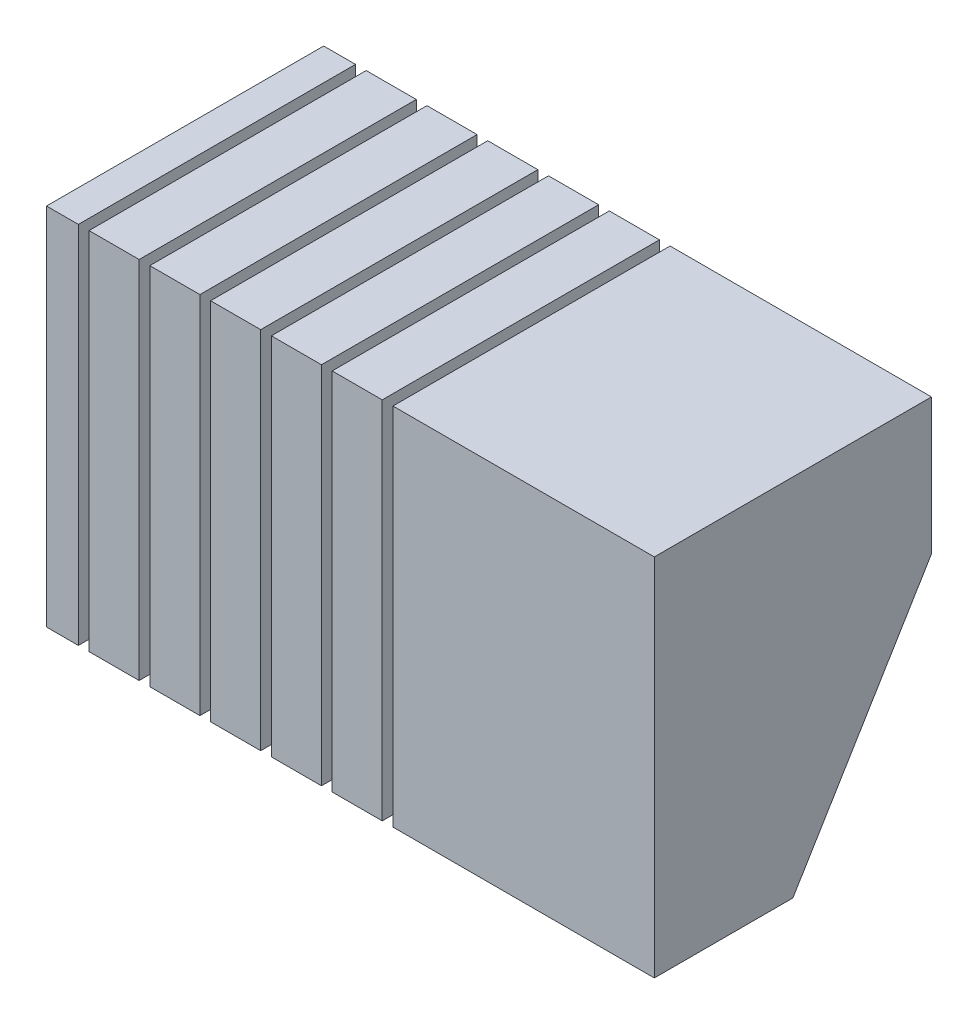
ISO-10303-21;
HEADER;
FILE_DESCRIPTION(('STEP AP214'),'2;1');
FILE_NAME('part.step','',(''),(''),'','','');
FILE_SCHEMA(('AUTOMOTIVE_DESIGN { 1 0 10303 214 1 1 1 1 }'));
ENDSEC;
DATA;
#1=APPLICATION_CONTEXT('core data for automotive mechanical design processes');
#2=APPLICATION_PROTOCOL_DEFINITION('international standard','automotive_design',2000,#1);
#3=PRODUCT_CONTEXT('',#1,'mechanical');
#4=PRODUCT('Part','Part','',(#3));
#5=PRODUCT_RELATED_PRODUCT_CATEGORY('part','',(#4));
#6=PRODUCT_DEFINITION_FORMATION('','',#4);
#7=PRODUCT_DEFINITION_CONTEXT('part definition',#1,'design');
#8=PRODUCT_DEFINITION('design','',#6,#7);
#9=PRODUCT_DEFINITION_SHAPE('','',#8);
#10=(LENGTH_UNIT() NAMED_UNIT(*) SI_UNIT(.MILLI.,.METRE.));
#11=(NAMED_UNIT(*) PLANE_ANGLE_UNIT() SI_UNIT($,.RADIAN.));
#12=(NAMED_UNIT(*) SI_UNIT($,.STERADIAN.) SOLID_ANGLE_UNIT());
#13=UNCERTAINTY_MEASURE_WITH_UNIT(LENGTH_MEASURE(1.E-05),#10,'distance_accuracy_value','');
#14=(GEOMETRIC_REPRESENTATION_CONTEXT(3) GLOBAL_UNCERTAINTY_ASSIGNED_CONTEXT((#13)) GLOBAL_UNIT_ASSIGNED_CONTEXT((#10,
#11,#12)) REPRESENTATION_CONTEXT('',''));
#15=CARTESIAN_POINT('',(0.,0.,0.));
#16=DIRECTION('',(0.,0.,1.));
#17=DIRECTION('',(1.,0.,0.));
#18=AXIS2_PLACEMENT_3D('',#15,#16,#17);
#19=CARTESIAN_POINT('',(125.,-75.,114.));
#20=DIRECTION('',(-1.,0.,0.));
#21=DIRECTION('',(0.,0.,1.));
#22=AXIS2_PLACEMENT_3D('',#19,#20,#21);
#23=PLANE('',#22);
#24=DIRECTION('',(0.,-0.855226725322334,0.518254038377355));
#25=VECTOR('',#24,1.);
#26=CARTESIAN_POINT('',(125.,-100.263808135213,72.3094731527829));
#27=LINE('',#26,#25);
#28=CARTESIAN_POINT('',(125.,19.0618301711685,0.));
#29=VERTEX_POINT('',#28);
#30=CARTESIAN_POINT('',(125.,-75.,56.9999999999999));
#31=VERTEX_POINT('',#30);
#32=EDGE_CURVE('E123',#29,#31,#27,.T.);
#33=ORIENTED_EDGE('',*,*,#32,.F.);
#34=DIRECTION('',(0.,1.,0.));
#35=VECTOR('',#34,1.);
#36=CARTESIAN_POINT('',(125.,-75.,0.));
#37=LINE('',#36,#35);
#38=CARTESIAN_POINT('',(125.,75.,0.));
#39=VERTEX_POINT('',#38);
#40=EDGE_CURVE('E115',#29,#39,#37,.T.);
#41=ORIENTED_EDGE('',*,*,#40,.T.);
#42=DIRECTION('',(0.,0.,-1.));
#43=VECTOR('',#42,1.);
#44=CARTESIAN_POINT('',(125.,75.,114.));
#45=LINE('',#44,#43);
#46=CARTESIAN_POINT('',(125.,75.,114.));
#47=VERTEX_POINT('',#46);
#48=EDGE_CURVE('E127',#47,#39,#45,.T.);
#49=ORIENTED_EDGE('',*,*,#48,.F.);
#50=DIRECTION('',(0.,1.,0.));
#51=VECTOR('',#50,1.);
#52=CARTESIAN_POINT('',(125.,-75.,114.));
#53=LINE('',#52,#51);
#54=CARTESIAN_POINT('',(125.,-75.,114.));
#55=VERTEX_POINT('',#54);
#56=EDGE_CURVE('E119',#55,#47,#53,.T.);
#57=ORIENTED_EDGE('',*,*,#56,.F.);
#58=DIRECTION('',(0.,0.,-1.));
#59=VECTOR('',#58,1.);
#60=CARTESIAN_POINT('',(125.,-75.,114.));
#61=LINE('',#60,#59);
#62=EDGE_CURVE('E110',#55,#31,#61,.T.);
#63=ORIENTED_EDGE('',*,*,#62,.T.);
#64=EDGE_LOOP('',(#33,#41,#49,#57,#63));
#65=FACE_BOUND('',#64,.T.);
#66=ADVANCED_FACE('F49',(#65),#23,.F.);
#67=CARTESIAN_POINT('',(-125.,-75.,114.));
#68=DIRECTION('',(0.,1.,0.));
#69=DIRECTION('',(0.,0.,1.));
#70=AXIS2_PLACEMENT_3D('',#67,#68,#69);
#71=PLANE('',#70);
#72=DIRECTION('',(1.,0.,0.));
#73=VECTOR('',#72,1.);
#74=CARTESIAN_POINT('',(-125.,-75.,114.));
#75=LINE('',#74,#73);
#76=CARTESIAN_POINT('',(17.4871129549344,-75.,114.));
#77=VERTEX_POINT('',#76);
#78=EDGE_CURVE('E105',#77,#55,#75,.T.);
#79=ORIENTED_EDGE('',*,*,#78,.F.);
#80=DIRECTION('',(0.,0.,1.));
#81=VECTOR('',#80,1.);
#82=CARTESIAN_POINT('',(17.4871129549344,-75.,-16.0571550711005));
#83=LINE('',#82,#81);
#84=CARTESIAN_POINT('',(17.4871129549344,-75.,0.));
#85=VERTEX_POINT('',#84);
#86=EDGE_CURVE('E12',#85,#77,#83,.T.);
#87=ORIENTED_EDGE('',*,*,#86,.F.);
#88=DIRECTION('',(1.,0.,0.));
#89=VECTOR('',#88,1.);
#90=CARTESIAN_POINT('',(-125.,-75.,0.));
#91=LINE('',#90,#89);
#92=CARTESIAN_POINT('',(42.292495755744,-75.,0.));
#93=VERTEX_POINT('',#92);
#94=EDGE_CURVE('E102',#85,#93,#91,.T.);
#95=ORIENTED_EDGE('',*,*,#94,.T.);
#96=DIRECTION('',(-0.823397266330031,0.,-0.567465366168044));
#97=VECTOR('',#96,1.);
#98=CARTESIAN_POINT('',(-17.862546969277,-75.,-41.4573921273211));
#99=LINE('',#98,#97);
#100=EDGE_CURVE('E97',#31,#93,#99,.T.);
#101=ORIENTED_EDGE('',*,*,#100,.F.);
#102=ORIENTED_EDGE('',*,*,#62,.F.);
#103=EDGE_LOOP('',(#79,#87,#95,#101,#102));
#104=FACE_BOUND('',#103,.T.);
#105=ADVANCED_FACE('F51',(#104),#71,.F.);
#106=CARTESIAN_POINT('',(0.,0.,0.));
#107=DIRECTION('',(0.,0.,-1.));
#108=DIRECTION('',(-1.,0.,0.));
#109=AXIS2_PLACEMENT_3D('',#106,#107,#108);
#110=PLANE('',#109);
#111=DIRECTION('',(0.,-1.,0.));
#112=VECTOR('',#111,1.);
#113=CARTESIAN_POINT('',(17.4871129549344,0.,0.));
#114=LINE('',#113,#112);
#115=CARTESIAN_POINT('',(17.4871129549344,75.,0.));
#116=VERTEX_POINT('',#115);
#117=EDGE_CURVE('E59',#116,#85,#114,.T.);
#118=ORIENTED_EDGE('',*,*,#117,.F.);
#119=DIRECTION('',(-1.,0.,0.));
#120=VECTOR('',#119,1.);
#121=CARTESIAN_POINT('',(-125.,75.,0.));
#122=LINE('',#121,#120);
#123=EDGE_CURVE('E112',#39,#116,#122,.T.);
#124=ORIENTED_EDGE('',*,*,#123,.F.);
#125=ORIENTED_EDGE('',*,*,#40,.F.);
#126=DIRECTION('',(-0.66032679808164,-0.750978375011724,0.));
#127=VECTOR('',#126,1.);
#128=CARTESIAN_POINT('',(61.0434721622796,-53.6748351989157,0.));
#129=LINE('',#128,#127);
#130=EDGE_CURVE('E109',#29,#93,#129,.T.);
#131=ORIENTED_EDGE('',*,*,#130,.T.);
#132=ORIENTED_EDGE('',*,*,#94,.F.);
#133=EDGE_LOOP('',(#118,#124,#125,#131,#132));
#134=FACE_BOUND('',#133,.T.);
#135=ADVANCED_FACE('F107',(#134),#110,.T.);
#136=CARTESIAN_POINT('',(-125.,75.,114.));
#137=DIRECTION('',(0.,-1.,0.));
#138=DIRECTION('',(0.,0.,-1.));
#139=AXIS2_PLACEMENT_3D('',#136,#137,#138);
#140=PLANE('',#139);
#141=ORIENTED_EDGE('',*,*,#123,.T.);
#142=DIRECTION('',(0.,0.,1.));
#143=VECTOR('',#142,1.);
#144=CARTESIAN_POINT('',(17.4871129549344,75.,-16.0571550711005));
#145=LINE('',#144,#143);
#146=CARTESIAN_POINT('',(17.4871129549344,75.,114.));
#147=VERTEX_POINT('',#146);
#148=EDGE_CURVE('E67',#116,#147,#145,.T.);
#149=ORIENTED_EDGE('',*,*,#148,.T.);
#150=DIRECTION('',(-1.,0.,0.));
#151=VECTOR('',#150,1.);
#152=CARTESIAN_POINT('',(-125.,75.,114.));
#153=LINE('',#152,#151);
#154=EDGE_CURVE('E53',#47,#147,#153,.T.);
#155=ORIENTED_EDGE('',*,*,#154,.F.);
#156=ORIENTED_EDGE('',*,*,#48,.T.);
#157=EDGE_LOOP('',(#141,#149,#155,#156));
#158=FACE_BOUND('',#157,.T.);
#159=ADVANCED_FACE('F135',(#158),#140,.F.);
#160=CARTESIAN_POINT('',(0.,0.,114.));
#161=DIRECTION('',(0.,0.,-1.));
#162=DIRECTION('',(-1.,0.,0.));
#163=AXIS2_PLACEMENT_3D('',#160,#161,#162);
#164=PLANE('',#163);
#165=ORIENTED_EDGE('',*,*,#154,.T.);
#166=DIRECTION('',(0.,-1.,0.));
#167=VECTOR('',#166,1.);
#168=CARTESIAN_POINT('',(17.4871129549344,0.,114.));
#169=LINE('',#168,#167);
#170=EDGE_CURVE('E120',#147,#77,#169,.T.);
#171=ORIENTED_EDGE('',*,*,#170,.T.);
#172=ORIENTED_EDGE('',*,*,#78,.T.);
#173=ORIENTED_EDGE('',*,*,#56,.T.);
#174=EDGE_LOOP('',(#165,#171,#172,#173));
#175=FACE_BOUND('',#174,.T.);
#176=ADVANCED_FACE('F136',(#175),#164,.F.);
#177=CARTESIAN_POINT('',(27.9069349234818,-24.5382524923008,-40.4932094496149));
#178=DIRECTION('',(0.507766315458884,-0.446473182740372,-0.736773415629929));
#179=DIRECTION('',(-0.823397266330031,0.,-0.567465366168044));
#180=AXIS2_PLACEMENT_3D('',#177,#178,#179);
#181=PLANE('',#180);
#182=ORIENTED_EDGE('',*,*,#32,.T.);
#183=ORIENTED_EDGE('',*,*,#100,.T.);
#184=ORIENTED_EDGE('',*,*,#130,.F.);
#185=EDGE_LOOP('',(#182,#183,#184));
#186=FACE_BOUND('',#185,.T.);
#187=ADVANCED_FACE('F141',(#186),#181,.T.);
#188=CARTESIAN_POINT('',(17.4871129549344,75.,-16.0571550711005));
#189=DIRECTION('',(1.,0.,0.));
#190=DIRECTION('',(0.,0.,-1.));
#191=AXIS2_PLACEMENT_3D('',#188,#189,#190);
#192=PLANE('',#191);
#193=ORIENTED_EDGE('',*,*,#117,.T.);
#194=ORIENTED_EDGE('',*,*,#86,.T.);
#195=ORIENTED_EDGE('',*,*,#170,.F.);
#196=ORIENTED_EDGE('',*,*,#148,.F.);
#197=EDGE_LOOP('',(#193,#194,#195,#196));
#198=FACE_BOUND('',#197,.T.);
#199=ADVANCED_FACE('F92',(#198),#192,.F.);
#200=CLOSED_SHELL('',(#66,#105,#135,#159,#176,#187,#199));
#201=MANIFOLD_SOLID_BREP('B2',#200);
#202=CARTESIAN_POINT('',(0.,0.,114.));
#203=DIRECTION('',(0.,0.,-1.));
#204=DIRECTION('',(-1.,0.,0.));
#205=AXIS2_PLACEMENT_3D('',#202,#203,#204);
#206=PLANE('',#205);
#207=DIRECTION('',(-1.,0.,0.));
#208=VECTOR('',#207,1.);
#209=CARTESIAN_POINT('',(-125.,75.,114.));
#210=LINE('',#209,#208);
#211=CARTESIAN_POINT('',(13.089023351992,75.,114.));
#212=VERTEX_POINT('',#211);
#213=CARTESIAN_POINT('',(-7.51288704506556,75.,114.));
#214=VERTEX_POINT('',#213);
#215=EDGE_CURVE('E212',#212,#214,#210,.T.);
#216=ORIENTED_EDGE('',*,*,#215,.T.);
#217=DIRECTION('',(0.,-1.,0.));
#218=VECTOR('',#217,1.);
#219=CARTESIAN_POINT('',(-7.51288704506556,0.,114.));
#220=LINE('',#219,#218);
#221=CARTESIAN_POINT('',(-7.51288704506556,-75.,114.));
#222=VERTEX_POINT('',#221);
#223=EDGE_CURVE('E254',#214,#222,#220,.T.);
#224=ORIENTED_EDGE('',*,*,#223,.T.);
#225=DIRECTION('',(1.,0.,0.));
#226=VECTOR('',#225,1.);
#227=CARTESIAN_POINT('',(-125.,-75.,114.));
#228=LINE('',#227,#226);
#229=CARTESIAN_POINT('',(13.089023351992,-75.,114.));
#230=VERTEX_POINT('',#229);
#231=EDGE_CURVE('E262',#222,#230,#228,.T.);
#232=ORIENTED_EDGE('',*,*,#231,.T.);
#233=DIRECTION('',(0.,1.,0.));
#234=VECTOR('',#233,1.);
#235=CARTESIAN_POINT('',(13.089023351992,0.,114.));
#236=LINE('',#235,#234);
#237=EDGE_CURVE('E247',#230,#212,#236,.T.);
#238=ORIENTED_EDGE('',*,*,#237,.T.);
#239=EDGE_LOOP('',(#216,#224,#232,#238));
#240=FACE_BOUND('',#239,.T.);
#241=ADVANCED_FACE('F208',(#240),#206,.F.);
#242=CARTESIAN_POINT('',(-125.,75.,114.));
#243=DIRECTION('',(0.,-1.,0.));
#244=DIRECTION('',(0.,0.,-1.));
#245=AXIS2_PLACEMENT_3D('',#242,#243,#244);
#246=PLANE('',#245);
#247=DIRECTION('',(-1.,0.,0.));
#248=VECTOR('',#247,1.);
#249=CARTESIAN_POINT('',(-125.,75.,0.));
#250=LINE('',#249,#248);
#251=CARTESIAN_POINT('',(13.089023351992,75.,0.));
#252=VERTEX_POINT('',#251);
#253=CARTESIAN_POINT('',(-7.51288704506556,75.,0.));
#254=VERTEX_POINT('',#253);
#255=EDGE_CURVE('E265',#252,#254,#250,.T.);
#256=ORIENTED_EDGE('',*,*,#255,.T.);
#257=DIRECTION('',(0.,0.,1.));
#258=VECTOR('',#257,1.);
#259=CARTESIAN_POINT('',(-7.51288704506556,75.,-16.0571550711005));
#260=LINE('',#259,#258);
#261=EDGE_CURVE('E227',#254,#214,#260,.T.);
#262=ORIENTED_EDGE('',*,*,#261,.T.);
#263=ORIENTED_EDGE('',*,*,#215,.F.);
#264=DIRECTION('',(0.,0.,-1.));
#265=VECTOR('',#264,1.);
#266=CARTESIAN_POINT('',(13.089023351992,75.,-16.0571550711005));
#267=LINE('',#266,#265);
#268=EDGE_CURVE('E249',#212,#252,#267,.T.);
#269=ORIENTED_EDGE('',*,*,#268,.T.);
#270=EDGE_LOOP('',(#256,#262,#263,#269));
#271=FACE_BOUND('',#270,.T.);
#272=ADVANCED_FACE('F281',(#271),#246,.F.);
#273=CARTESIAN_POINT('',(0.,0.,0.));
#274=DIRECTION('',(0.,0.,-1.));
#275=DIRECTION('',(-1.,0.,0.));
#276=AXIS2_PLACEMENT_3D('',#273,#274,#275);
#277=PLANE('',#276);
#278=DIRECTION('',(0.,-1.,0.));
#279=VECTOR('',#278,1.);
#280=CARTESIAN_POINT('',(-7.51288704506556,0.,0.));
#281=LINE('',#280,#279);
#282=CARTESIAN_POINT('',(-7.51288704506556,-75.,0.));
#283=VERTEX_POINT('',#282);
#284=EDGE_CURVE('E218',#254,#283,#281,.T.);
#285=ORIENTED_EDGE('',*,*,#284,.F.);
#286=ORIENTED_EDGE('',*,*,#255,.F.);
#287=DIRECTION('',(0.,1.,0.));
#288=VECTOR('',#287,1.);
#289=CARTESIAN_POINT('',(13.089023351992,0.,0.));
#290=LINE('',#289,#288);
#291=CARTESIAN_POINT('',(13.089023351992,-75.,0.));
#292=VERTEX_POINT('',#291);
#293=EDGE_CURVE('E272',#292,#252,#290,.T.);
#294=ORIENTED_EDGE('',*,*,#293,.F.);
#295=DIRECTION('',(1.,0.,0.));
#296=VECTOR('',#295,1.);
#297=CARTESIAN_POINT('',(-125.,-75.,0.));
#298=LINE('',#297,#296);
#299=EDGE_CURVE('E270',#283,#292,#298,.T.);
#300=ORIENTED_EDGE('',*,*,#299,.F.);
#301=EDGE_LOOP('',(#285,#286,#294,#300));
#302=FACE_BOUND('',#301,.T.);
#303=ADVANCED_FACE('F282',(#302),#277,.T.);
#304=CARTESIAN_POINT('',(-125.,-75.,114.));
#305=DIRECTION('',(0.,1.,0.));
#306=DIRECTION('',(0.,0.,1.));
#307=AXIS2_PLACEMENT_3D('',#304,#305,#306);
#308=PLANE('',#307);
#309=ORIENTED_EDGE('',*,*,#231,.F.);
#310=DIRECTION('',(0.,0.,1.));
#311=VECTOR('',#310,1.);
#312=CARTESIAN_POINT('',(-7.51288704506556,-75.,-16.0571550711005));
#313=LINE('',#312,#311);
#314=EDGE_CURVE('E47',#283,#222,#313,.T.);
#315=ORIENTED_EDGE('',*,*,#314,.F.);
#316=ORIENTED_EDGE('',*,*,#299,.T.);
#317=DIRECTION('',(0.,0.,-1.));
#318=VECTOR('',#317,1.);
#319=CARTESIAN_POINT('',(13.089023351992,-75.,-16.0571550711005));
#320=LINE('',#319,#318);
#321=EDGE_CURVE('E243',#230,#292,#320,.T.);
#322=ORIENTED_EDGE('',*,*,#321,.F.);
#323=EDGE_LOOP('',(#309,#315,#316,#322));
#324=FACE_BOUND('',#323,.T.);
#325=ADVANCED_FACE('F210',(#324),#308,.F.);
#326=CARTESIAN_POINT('',(13.089023351992,75.,-16.0571550711005));
#327=DIRECTION('',(-1.,0.,0.));
#328=DIRECTION('',(0.,0.,1.));
#329=AXIS2_PLACEMENT_3D('',#326,#327,#328);
#330=PLANE('',#329);
#331=ORIENTED_EDGE('',*,*,#293,.T.);
#332=ORIENTED_EDGE('',*,*,#268,.F.);
#333=ORIENTED_EDGE('',*,*,#237,.F.);
#334=ORIENTED_EDGE('',*,*,#321,.T.);
#335=EDGE_LOOP('',(#331,#332,#333,#334));
#336=FACE_BOUND('',#335,.T.);
#337=ADVANCED_FACE('F277',(#336),#330,.F.);
#338=CARTESIAN_POINT('',(-7.51288704506556,75.,-16.0571550711005));
#339=DIRECTION('',(1.,0.,0.));
#340=DIRECTION('',(0.,0.,-1.));
#341=AXIS2_PLACEMENT_3D('',#338,#339,#340);
#342=PLANE('',#341);
#343=ORIENTED_EDGE('',*,*,#284,.T.);
#344=ORIENTED_EDGE('',*,*,#314,.T.);
#345=ORIENTED_EDGE('',*,*,#223,.F.);
#346=ORIENTED_EDGE('',*,*,#261,.F.);
#347=EDGE_LOOP('',(#343,#344,#345,#346));
#348=FACE_BOUND('',#347,.T.);
#349=ADVANCED_FACE('F253',(#348),#342,.F.);
#350=CLOSED_SHELL('',(#241,#272,#303,#325,#337,#349));
#351=MANIFOLD_SOLID_BREP('B6',#350);
#352=CARTESIAN_POINT('',(0.,0.,114.));
#353=DIRECTION('',(0.,0.,-1.));
#354=DIRECTION('',(-1.,0.,0.));
#355=AXIS2_PLACEMENT_3D('',#352,#353,#354);
#356=PLANE('',#355);
#357=DIRECTION('',(-1.,0.,0.));
#358=VECTOR('',#357,1.);
#359=CARTESIAN_POINT('',(-125.,75.,114.));
#360=LINE('',#359,#358);
#361=CARTESIAN_POINT('',(-11.910976648008,75.,114.));
#362=VERTEX_POINT('',#361);
#363=CARTESIAN_POINT('',(-32.5128870450656,75.,114.));
#364=VERTEX_POINT('',#363);
#365=EDGE_CURVE('E345',#362,#364,#360,.T.);
#366=ORIENTED_EDGE('',*,*,#365,.T.);
#367=DIRECTION('',(0.,-1.,0.));
#368=VECTOR('',#367,1.);
#369=CARTESIAN_POINT('',(-32.5128870450656,0.,114.));
#370=LINE('',#369,#368);
#371=CARTESIAN_POINT('',(-32.5128870450656,-75.,114.));
#372=VERTEX_POINT('',#371);
#373=EDGE_CURVE('E387',#364,#372,#370,.T.);
#374=ORIENTED_EDGE('',*,*,#373,.T.);
#375=DIRECTION('',(1.,0.,0.));
#376=VECTOR('',#375,1.);
#377=CARTESIAN_POINT('',(-125.,-75.,114.));
#378=LINE('',#377,#376);
#379=CARTESIAN_POINT('',(-11.910976648008,-75.,114.));
#380=VERTEX_POINT('',#379);
#381=EDGE_CURVE('E395',#372,#380,#378,.T.);
#382=ORIENTED_EDGE('',*,*,#381,.T.);
#383=DIRECTION('',(0.,1.,0.));
#384=VECTOR('',#383,1.);
#385=CARTESIAN_POINT('',(-11.910976648008,0.,114.));
#386=LINE('',#385,#384);
#387=EDGE_CURVE('E380',#380,#362,#386,.T.);
#388=ORIENTED_EDGE('',*,*,#387,.T.);
#389=EDGE_LOOP('',(#366,#374,#382,#388));
#390=FACE_BOUND('',#389,.T.);
#391=ADVANCED_FACE('F341',(#390),#356,.F.);
#392=CARTESIAN_POINT('',(-125.,75.,114.));
#393=DIRECTION('',(0.,-1.,0.));
#394=DIRECTION('',(0.,0.,-1.));
#395=AXIS2_PLACEMENT_3D('',#392,#393,#394);
#396=PLANE('',#395);
#397=DIRECTION('',(-1.,0.,0.));
#398=VECTOR('',#397,1.);
#399=CARTESIAN_POINT('',(-125.,75.,0.));
#400=LINE('',#399,#398);
#401=CARTESIAN_POINT('',(-11.910976648008,75.,0.));
#402=VERTEX_POINT('',#401);
#403=CARTESIAN_POINT('',(-32.5128870450656,75.,0.));
#404=VERTEX_POINT('',#403);
#405=EDGE_CURVE('E398',#402,#404,#400,.T.);
#406=ORIENTED_EDGE('',*,*,#405,.T.);
#407=DIRECTION('',(0.,0.,1.));
#408=VECTOR('',#407,1.);
#409=CARTESIAN_POINT('',(-32.5128870450656,75.,-16.0571550711005));
#410=LINE('',#409,#408);
#411=EDGE_CURVE('E360',#404,#364,#410,.T.);
#412=ORIENTED_EDGE('',*,*,#411,.T.);
#413=ORIENTED_EDGE('',*,*,#365,.F.);
#414=DIRECTION('',(0.,0.,-1.));
#415=VECTOR('',#414,1.);
#416=CARTESIAN_POINT('',(-11.910976648008,75.,-16.0571550711005));
#417=LINE('',#416,#415);
#418=EDGE_CURVE('E382',#362,#402,#417,.T.);
#419=ORIENTED_EDGE('',*,*,#418,.T.);
#420=EDGE_LOOP('',(#406,#412,#413,#419));
#421=FACE_BOUND('',#420,.T.);
#422=ADVANCED_FACE('F414',(#421),#396,.F.);
#423=CARTESIAN_POINT('',(0.,0.,0.));
#424=DIRECTION('',(0.,0.,-1.));
#425=DIRECTION('',(-1.,0.,0.));
#426=AXIS2_PLACEMENT_3D('',#423,#424,#425);
#427=PLANE('',#426);
#428=DIRECTION('',(0.,-1.,0.));
#429=VECTOR('',#428,1.);
#430=CARTESIAN_POINT('',(-32.5128870450656,0.,0.));
#431=LINE('',#430,#429);
#432=CARTESIAN_POINT('',(-32.5128870450656,-75.,0.));
#433=VERTEX_POINT('',#432);
#434=EDGE_CURVE('E351',#404,#433,#431,.T.);
#435=ORIENTED_EDGE('',*,*,#434,.F.);
#436=ORIENTED_EDGE('',*,*,#405,.F.);
#437=DIRECTION('',(0.,1.,0.));
#438=VECTOR('',#437,1.);
#439=CARTESIAN_POINT('',(-11.910976648008,0.,0.));
#440=LINE('',#439,#438);
#441=CARTESIAN_POINT('',(-11.910976648008,-75.,0.));
#442=VERTEX_POINT('',#441);
#443=EDGE_CURVE('E405',#442,#402,#440,.T.);
#444=ORIENTED_EDGE('',*,*,#443,.F.);
#445=DIRECTION('',(1.,0.,0.));
#446=VECTOR('',#445,1.);
#447=CARTESIAN_POINT('',(-125.,-75.,0.));
#448=LINE('',#447,#446);
#449=EDGE_CURVE('E403',#433,#442,#448,.T.);
#450=ORIENTED_EDGE('',*,*,#449,.F.);
#451=EDGE_LOOP('',(#435,#436,#444,#450));
#452=FACE_BOUND('',#451,.T.);
#453=ADVANCED_FACE('F415',(#452),#427,.T.);
#454=CARTESIAN_POINT('',(-125.,-75.,114.));
#455=DIRECTION('',(0.,1.,0.));
#456=DIRECTION('',(0.,0.,1.));
#457=AXIS2_PLACEMENT_3D('',#454,#455,#456);
#458=PLANE('',#457);
#459=ORIENTED_EDGE('',*,*,#381,.F.);
#460=DIRECTION('',(0.,0.,1.));
#461=VECTOR('',#460,1.);
#462=CARTESIAN_POINT('',(-32.5128870450656,-75.,-16.0571550711005));
#463=LINE('',#462,#461);
#464=EDGE_CURVE('E206',#433,#372,#463,.T.);
#465=ORIENTED_EDGE('',*,*,#464,.F.);
#466=ORIENTED_EDGE('',*,*,#449,.T.);
#467=DIRECTION('',(0.,0.,-1.));
#468=VECTOR('',#467,1.);
#469=CARTESIAN_POINT('',(-11.910976648008,-75.,-16.0571550711005));
#470=LINE('',#469,#468);
#471=EDGE_CURVE('E376',#380,#442,#470,.T.);
#472=ORIENTED_EDGE('',*,*,#471,.F.);
#473=EDGE_LOOP('',(#459,#465,#466,#472));
#474=FACE_BOUND('',#473,.T.);
#475=ADVANCED_FACE('F343',(#474),#458,.F.);
#476=CARTESIAN_POINT('',(-11.910976648008,75.,-16.0571550711005));
#477=DIRECTION('',(-1.,0.,0.));
#478=DIRECTION('',(0.,0.,1.));
#479=AXIS2_PLACEMENT_3D('',#476,#477,#478);
#480=PLANE('',#479);
#481=ORIENTED_EDGE('',*,*,#443,.T.);
#482=ORIENTED_EDGE('',*,*,#418,.F.);
#483=ORIENTED_EDGE('',*,*,#387,.F.);
#484=ORIENTED_EDGE('',*,*,#471,.T.);
#485=EDGE_LOOP('',(#481,#482,#483,#484));
#486=FACE_BOUND('',#485,.T.);
#487=ADVANCED_FACE('F410',(#486),#480,.F.);
#488=CARTESIAN_POINT('',(-32.5128870450656,75.,-16.0571550711005));
#489=DIRECTION('',(1.,0.,0.));
#490=DIRECTION('',(0.,0.,-1.));
#491=AXIS2_PLACEMENT_3D('',#488,#489,#490);
#492=PLANE('',#491);
#493=ORIENTED_EDGE('',*,*,#434,.T.);
#494=ORIENTED_EDGE('',*,*,#464,.T.);
#495=ORIENTED_EDGE('',*,*,#373,.F.);
#496=ORIENTED_EDGE('',*,*,#411,.F.);
#497=EDGE_LOOP('',(#493,#494,#495,#496));
#498=FACE_BOUND('',#497,.T.);
#499=ADVANCED_FACE('F386',(#498),#492,.F.);
#500=CLOSED_SHELL('',(#391,#422,#453,#475,#487,#499));
#501=MANIFOLD_SOLID_BREP('B41',#500);
#502=CARTESIAN_POINT('',(0.,0.,114.));
#503=DIRECTION('',(0.,0.,-1.));
#504=DIRECTION('',(-1.,0.,0.));
#505=AXIS2_PLACEMENT_3D('',#502,#503,#504);
#506=PLANE('',#505);
#507=DIRECTION('',(-1.,0.,0.));
#508=VECTOR('',#507,1.);
#509=CARTESIAN_POINT('',(-125.,75.,114.));
#510=LINE('',#509,#508);
#511=CARTESIAN_POINT('',(-36.910976648008,75.,114.));
#512=VERTEX_POINT('',#511);
#513=CARTESIAN_POINT('',(-57.5128870450656,75.,114.));
#514=VERTEX_POINT('',#513);
#515=EDGE_CURVE('E478',#512,#514,#510,.T.);
#516=ORIENTED_EDGE('',*,*,#515,.T.);
#517=DIRECTION('',(0.,-1.,0.));
#518=VECTOR('',#517,1.);
#519=CARTESIAN_POINT('',(-57.5128870450656,0.,114.));
#520=LINE('',#519,#518);
#521=CARTESIAN_POINT('',(-57.5128870450656,-75.,114.));
#522=VERTEX_POINT('',#521);
#523=EDGE_CURVE('E520',#514,#522,#520,.T.);
#524=ORIENTED_EDGE('',*,*,#523,.T.);
#525=DIRECTION('',(1.,0.,0.));
#526=VECTOR('',#525,1.);
#527=CARTESIAN_POINT('',(-125.,-75.,114.));
#528=LINE('',#527,#526);
#529=CARTESIAN_POINT('',(-36.910976648008,-75.,114.));
#530=VERTEX_POINT('',#529);
#531=EDGE_CURVE('E528',#522,#530,#528,.T.);
#532=ORIENTED_EDGE('',*,*,#531,.T.);
#533=DIRECTION('',(0.,1.,0.));
#534=VECTOR('',#533,1.);
#535=CARTESIAN_POINT('',(-36.910976648008,0.,114.));
#536=LINE('',#535,#534);
#537=EDGE_CURVE('E513',#530,#512,#536,.T.);
#538=ORIENTED_EDGE('',*,*,#537,.T.);
#539=EDGE_LOOP('',(#516,#524,#532,#538));
#540=FACE_BOUND('',#539,.T.);
#541=ADVANCED_FACE('F474',(#540),#506,.F.);
#542=CARTESIAN_POINT('',(-125.,75.,114.));
#543=DIRECTION('',(0.,-1.,0.));
#544=DIRECTION('',(0.,0.,-1.));
#545=AXIS2_PLACEMENT_3D('',#542,#543,#544);
#546=PLANE('',#545);
#547=DIRECTION('',(-1.,0.,0.));
#548=VECTOR('',#547,1.);
#549=CARTESIAN_POINT('',(-125.,75.,0.));
#550=LINE('',#549,#548);
#551=CARTESIAN_POINT('',(-36.910976648008,75.,0.));
#552=VERTEX_POINT('',#551);
#553=CARTESIAN_POINT('',(-57.5128870450656,75.,0.));
#554=VERTEX_POINT('',#553);
#555=EDGE_CURVE('E531',#552,#554,#550,.T.);
#556=ORIENTED_EDGE('',*,*,#555,.T.);
#557=DIRECTION('',(0.,0.,1.));
#558=VECTOR('',#557,1.);
#559=CARTESIAN_POINT('',(-57.5128870450656,75.,-16.0571550711005));
#560=LINE('',#559,#558);
#561=EDGE_CURVE('E493',#554,#514,#560,.T.);
#562=ORIENTED_EDGE('',*,*,#561,.T.);
#563=ORIENTED_EDGE('',*,*,#515,.F.);
#564=DIRECTION('',(0.,0.,-1.));
#565=VECTOR('',#564,1.);
#566=CARTESIAN_POINT('',(-36.910976648008,75.,-16.0571550711005));
#567=LINE('',#566,#565);
#568=EDGE_CURVE('E515',#512,#552,#567,.T.);
#569=ORIENTED_EDGE('',*,*,#568,.T.);
#570=EDGE_LOOP('',(#556,#562,#563,#569));
#571=FACE_BOUND('',#570,.T.);
#572=ADVANCED_FACE('F547',(#571),#546,.F.);
#573=CARTESIAN_POINT('',(0.,0.,0.));
#574=DIRECTION('',(0.,0.,-1.));
#575=DIRECTION('',(-1.,0.,0.));
#576=AXIS2_PLACEMENT_3D('',#573,#574,#575);
#577=PLANE('',#576);
#578=DIRECTION('',(0.,-1.,0.));
#579=VECTOR('',#578,1.);
#580=CARTESIAN_POINT('',(-57.5128870450656,0.,0.));
#581=LINE('',#580,#579);
#582=CARTESIAN_POINT('',(-57.5128870450656,-75.,0.));
#583=VERTEX_POINT('',#582);
#584=EDGE_CURVE('E484',#554,#583,#581,.T.);
#585=ORIENTED_EDGE('',*,*,#584,.F.);
#586=ORIENTED_EDGE('',*,*,#555,.F.);
#587=DIRECTION('',(0.,1.,0.));
#588=VECTOR('',#587,1.);
#589=CARTESIAN_POINT('',(-36.910976648008,0.,0.));
#590=LINE('',#589,#588);
#591=CARTESIAN_POINT('',(-36.910976648008,-75.,0.));
#592=VERTEX_POINT('',#591);
#593=EDGE_CURVE('E538',#592,#552,#590,.T.);
#594=ORIENTED_EDGE('',*,*,#593,.F.);
#595=DIRECTION('',(1.,0.,0.));
#596=VECTOR('',#595,1.);
#597=CARTESIAN_POINT('',(-125.,-75.,0.));
#598=LINE('',#597,#596);
#599=EDGE_CURVE('E536',#583,#592,#598,.T.);
#600=ORIENTED_EDGE('',*,*,#599,.F.);
#601=EDGE_LOOP('',(#585,#586,#594,#600));
#602=FACE_BOUND('',#601,.T.);
#603=ADVANCED_FACE('F548',(#602),#577,.T.);
#604=CARTESIAN_POINT('',(-125.,-75.,114.));
#605=DIRECTION('',(0.,1.,0.));
#606=DIRECTION('',(0.,0.,1.));
#607=AXIS2_PLACEMENT_3D('',#604,#605,#606);
#608=PLANE('',#607);
#609=ORIENTED_EDGE('',*,*,#531,.F.);
#610=DIRECTION('',(0.,0.,1.));
#611=VECTOR('',#610,1.);
#612=CARTESIAN_POINT('',(-57.5128870450656,-75.,-16.0571550711005));
#613=LINE('',#612,#611);
#614=EDGE_CURVE('E339',#583,#522,#613,.T.);
#615=ORIENTED_EDGE('',*,*,#614,.F.);
#616=ORIENTED_EDGE('',*,*,#599,.T.);
#617=DIRECTION('',(0.,0.,-1.));
#618=VECTOR('',#617,1.);
#619=CARTESIAN_POINT('',(-36.910976648008,-75.,-16.0571550711005));
#620=LINE('',#619,#618);
#621=EDGE_CURVE('E509',#530,#592,#620,.T.);
#622=ORIENTED_EDGE('',*,*,#621,.F.);
#623=EDGE_LOOP('',(#609,#615,#616,#622));
#624=FACE_BOUND('',#623,.T.);
#625=ADVANCED_FACE('F476',(#624),#608,.F.);
#626=CARTESIAN_POINT('',(-36.910976648008,75.,-16.0571550711005));
#627=DIRECTION('',(-1.,0.,0.));
#628=DIRECTION('',(0.,0.,1.));
#629=AXIS2_PLACEMENT_3D('',#626,#627,#628);
#630=PLANE('',#629);
#631=ORIENTED_EDGE('',*,*,#593,.T.);
#632=ORIENTED_EDGE('',*,*,#568,.F.);
#633=ORIENTED_EDGE('',*,*,#537,.F.);
#634=ORIENTED_EDGE('',*,*,#621,.T.);
#635=EDGE_LOOP('',(#631,#632,#633,#634));
#636=FACE_BOUND('',#635,.T.);
#637=ADVANCED_FACE('F543',(#636),#630,.F.);
#638=CARTESIAN_POINT('',(-57.5128870450656,75.,-16.0571550711005));
#639=DIRECTION('',(1.,0.,0.));
#640=DIRECTION('',(0.,0.,-1.));
#641=AXIS2_PLACEMENT_3D('',#638,#639,#640);
#642=PLANE('',#641);
#643=ORIENTED_EDGE('',*,*,#584,.T.);
#644=ORIENTED_EDGE('',*,*,#614,.T.);
#645=ORIENTED_EDGE('',*,*,#523,.F.);
#646=ORIENTED_EDGE('',*,*,#561,.F.);
#647=EDGE_LOOP('',(#643,#644,#645,#646));
#648=FACE_BOUND('',#647,.T.);
#649=ADVANCED_FACE('F519',(#648),#642,.F.);
#650=CLOSED_SHELL('',(#541,#572,#603,#625,#637,#649));
#651=MANIFOLD_SOLID_BREP('B200',#650);
#652=CARTESIAN_POINT('',(0.,0.,114.));
#653=DIRECTION('',(0.,0.,-1.));
#654=DIRECTION('',(-1.,0.,0.));
#655=AXIS2_PLACEMENT_3D('',#652,#653,#654);
#656=PLANE('',#655);
#657=DIRECTION('',(-1.,0.,0.));
#658=VECTOR('',#657,1.);
#659=CARTESIAN_POINT('',(-125.,75.,114.));
#660=LINE('',#659,#658);
#661=CARTESIAN_POINT('',(-61.910976648008,75.,114.));
#662=VERTEX_POINT('',#661);
#663=CARTESIAN_POINT('',(-82.5128870450656,75.,114.));
#664=VERTEX_POINT('',#663);
#665=EDGE_CURVE('E611',#662,#664,#660,.T.);
#666=ORIENTED_EDGE('',*,*,#665,.T.);
#667=DIRECTION('',(0.,-1.,0.));
#668=VECTOR('',#667,1.);
#669=CARTESIAN_POINT('',(-82.5128870450656,0.,114.));
#670=LINE('',#669,#668);
#671=CARTESIAN_POINT('',(-82.5128870450656,-75.,114.));
#672=VERTEX_POINT('',#671);
#673=EDGE_CURVE('E653',#664,#672,#670,.T.);
#674=ORIENTED_EDGE('',*,*,#673,.T.);
#675=DIRECTION('',(1.,0.,0.));
#676=VECTOR('',#675,1.);
#677=CARTESIAN_POINT('',(-125.,-75.,114.));
#678=LINE('',#677,#676);
#679=CARTESIAN_POINT('',(-61.910976648008,-75.,114.));
#680=VERTEX_POINT('',#679);
#681=EDGE_CURVE('E661',#672,#680,#678,.T.);
#682=ORIENTED_EDGE('',*,*,#681,.T.);
#683=DIRECTION('',(0.,1.,0.));
#684=VECTOR('',#683,1.);
#685=CARTESIAN_POINT('',(-61.910976648008,0.,114.));
#686=LINE('',#685,#684);
#687=EDGE_CURVE('E646',#680,#662,#686,.T.);
#688=ORIENTED_EDGE('',*,*,#687,.T.);
#689=EDGE_LOOP('',(#666,#674,#682,#688));
#690=FACE_BOUND('',#689,.T.);
#691=ADVANCED_FACE('F607',(#690),#656,.F.);
#692=CARTESIAN_POINT('',(-125.,75.,114.));
#693=DIRECTION('',(0.,-1.,0.));
#694=DIRECTION('',(0.,0.,-1.));
#695=AXIS2_PLACEMENT_3D('',#692,#693,#694);
#696=PLANE('',#695);
#697=DIRECTION('',(-1.,0.,0.));
#698=VECTOR('',#697,1.);
#699=CARTESIAN_POINT('',(-125.,75.,0.));
#700=LINE('',#699,#698);
#701=CARTESIAN_POINT('',(-61.910976648008,75.,0.));
#702=VERTEX_POINT('',#701);
#703=CARTESIAN_POINT('',(-82.5128870450656,75.,0.));
#704=VERTEX_POINT('',#703);
#705=EDGE_CURVE('E664',#702,#704,#700,.T.);
#706=ORIENTED_EDGE('',*,*,#705,.T.);
#707=DIRECTION('',(0.,0.,1.));
#708=VECTOR('',#707,1.);
#709=CARTESIAN_POINT('',(-82.5128870450656,75.,-16.0571550711005));
#710=LINE('',#709,#708);
#711=EDGE_CURVE('E626',#704,#664,#710,.T.);
#712=ORIENTED_EDGE('',*,*,#711,.T.);
#713=ORIENTED_EDGE('',*,*,#665,.F.);
#714=DIRECTION('',(0.,0.,-1.));
#715=VECTOR('',#714,1.);
#716=CARTESIAN_POINT('',(-61.910976648008,75.,-16.0571550711005));
#717=LINE('',#716,#715);
#718=EDGE_CURVE('E648',#662,#702,#717,.T.);
#719=ORIENTED_EDGE('',*,*,#718,.T.);
#720=EDGE_LOOP('',(#706,#712,#713,#719));
#721=FACE_BOUND('',#720,.T.);
#722=ADVANCED_FACE('F680',(#721),#696,.F.);
#723=CARTESIAN_POINT('',(0.,0.,0.));
#724=DIRECTION('',(0.,0.,-1.));
#725=DIRECTION('',(-1.,0.,0.));
#726=AXIS2_PLACEMENT_3D('',#723,#724,#725);
#727=PLANE('',#726);
#728=DIRECTION('',(0.,-1.,0.));
#729=VECTOR('',#728,1.);
#730=CARTESIAN_POINT('',(-82.5128870450656,0.,0.));
#731=LINE('',#730,#729);
#732=CARTESIAN_POINT('',(-82.5128870450656,-75.,0.));
#733=VERTEX_POINT('',#732);
#734=EDGE_CURVE('E617',#704,#733,#731,.T.);
#735=ORIENTED_EDGE('',*,*,#734,.F.);
#736=ORIENTED_EDGE('',*,*,#705,.F.);
#737=DIRECTION('',(0.,1.,0.));
#738=VECTOR('',#737,1.);
#739=CARTESIAN_POINT('',(-61.910976648008,0.,0.));
#740=LINE('',#739,#738);
#741=CARTESIAN_POINT('',(-61.910976648008,-75.,0.));
#742=VERTEX_POINT('',#741);
#743=EDGE_CURVE('E671',#742,#702,#740,.T.);
#744=ORIENTED_EDGE('',*,*,#743,.F.);
#745=DIRECTION('',(1.,0.,0.));
#746=VECTOR('',#745,1.);
#747=CARTESIAN_POINT('',(-125.,-75.,0.));
#748=LINE('',#747,#746);
#749=EDGE_CURVE('E669',#733,#742,#748,.T.);
#750=ORIENTED_EDGE('',*,*,#749,.F.);
#751=EDGE_LOOP('',(#735,#736,#744,#750));
#752=FACE_BOUND('',#751,.T.);
#753=ADVANCED_FACE('F681',(#752),#727,.T.);
#754=CARTESIAN_POINT('',(-125.,-75.,114.));
#755=DIRECTION('',(0.,1.,0.));
#756=DIRECTION('',(0.,0.,1.));
#757=AXIS2_PLACEMENT_3D('',#754,#755,#756);
#758=PLANE('',#757);
#759=ORIENTED_EDGE('',*,*,#681,.F.);
#760=DIRECTION('',(0.,0.,1.));
#761=VECTOR('',#760,1.);
#762=CARTESIAN_POINT('',(-82.5128870450656,-75.,-16.0571550711005));
#763=LINE('',#762,#761);
#764=EDGE_CURVE('E472',#733,#672,#763,.T.);
#765=ORIENTED_EDGE('',*,*,#764,.F.);
#766=ORIENTED_EDGE('',*,*,#749,.T.);
#767=DIRECTION('',(0.,0.,-1.));
#768=VECTOR('',#767,1.);
#769=CARTESIAN_POINT('',(-61.910976648008,-75.,-16.0571550711005));
#770=LINE('',#769,#768);
#771=EDGE_CURVE('E642',#680,#742,#770,.T.);
#772=ORIENTED_EDGE('',*,*,#771,.F.);
#773=EDGE_LOOP('',(#759,#765,#766,#772));
#774=FACE_BOUND('',#773,.T.);
#775=ADVANCED_FACE('F609',(#774),#758,.F.);
#776=CARTESIAN_POINT('',(-61.910976648008,75.,-16.0571550711005));
#777=DIRECTION('',(-1.,0.,0.));
#778=DIRECTION('',(0.,0.,1.));
#779=AXIS2_PLACEMENT_3D('',#776,#777,#778);
#780=PLANE('',#779);
#781=ORIENTED_EDGE('',*,*,#743,.T.);
#782=ORIENTED_EDGE('',*,*,#718,.F.);
#783=ORIENTED_EDGE('',*,*,#687,.F.);
#784=ORIENTED_EDGE('',*,*,#771,.T.);
#785=EDGE_LOOP('',(#781,#782,#783,#784));
#786=FACE_BOUND('',#785,.T.);
#787=ADVANCED_FACE('F676',(#786),#780,.F.);
#788=CARTESIAN_POINT('',(-82.5128870450656,75.,-16.0571550711005));
#789=DIRECTION('',(1.,0.,0.));
#790=DIRECTION('',(0.,0.,-1.));
#791=AXIS2_PLACEMENT_3D('',#788,#789,#790);
#792=PLANE('',#791);
#793=ORIENTED_EDGE('',*,*,#734,.T.);
#794=ORIENTED_EDGE('',*,*,#764,.T.);
#795=ORIENTED_EDGE('',*,*,#673,.F.);
#796=ORIENTED_EDGE('',*,*,#711,.F.);
#797=EDGE_LOOP('',(#793,#794,#795,#796));
#798=FACE_BOUND('',#797,.T.);
#799=ADVANCED_FACE('F652',(#798),#792,.F.);
#800=CLOSED_SHELL('',(#691,#722,#753,#775,#787,#799));
#801=MANIFOLD_SOLID_BREP('B333',#800);
#802=CARTESIAN_POINT('',(-107.512887045066,75.,-16.0571550711005));
#803=DIRECTION('',(1.,0.,0.));
#804=DIRECTION('',(0.,0.,-1.));
#805=AXIS2_PLACEMENT_3D('',#802,#803,#804);
#806=PLANE('',#805);
#807=DIRECTION('',(0.,-1.,0.));
#808=VECTOR('',#807,1.);
#809=CARTESIAN_POINT('',(-107.512887045066,0.,0.));
#810=LINE('',#809,#808);
#811=CARTESIAN_POINT('',(-107.512887045066,75.,0.));
#812=VERTEX_POINT('',#811);
#813=CARTESIAN_POINT('',(-107.512887045066,-75.,0.));
#814=VERTEX_POINT('',#813);
#815=EDGE_CURVE('E773',#812,#814,#810,.T.);
#816=ORIENTED_EDGE('',*,*,#815,.T.);
#817=DIRECTION('',(0.,0.,1.));
#818=VECTOR('',#817,1.);
#819=CARTESIAN_POINT('',(-107.512887045066,-75.,-16.0571550711005));
#820=LINE('',#819,#818);
#821=CARTESIAN_POINT('',(-107.512887045066,-75.,114.));
#822=VERTEX_POINT('',#821);
#823=EDGE_CURVE('E747',#814,#822,#820,.T.);
#824=ORIENTED_EDGE('',*,*,#823,.T.);
#825=DIRECTION('',(0.,-1.,0.));
#826=VECTOR('',#825,1.);
#827=CARTESIAN_POINT('',(-107.512887045066,0.,114.));
#828=LINE('',#827,#826);
#829=CARTESIAN_POINT('',(-107.512887045066,75.,114.));
#830=VERTEX_POINT('',#829);
#831=EDGE_CURVE('E799',#830,#822,#828,.T.);
#832=ORIENTED_EDGE('',*,*,#831,.F.);
#833=DIRECTION('',(0.,0.,1.));
#834=VECTOR('',#833,1.);
#835=CARTESIAN_POINT('',(-107.512887045066,75.,-16.0571550711005));
#836=LINE('',#835,#834);
#837=EDGE_CURVE('E806',#812,#830,#836,.T.);
#838=ORIENTED_EDGE('',*,*,#837,.F.);
#839=EDGE_LOOP('',(#816,#824,#832,#838));
#840=FACE_BOUND('',#839,.T.);
#841=ADVANCED_FACE('F739',(#840),#806,.F.);
#842=CARTESIAN_POINT('',(0.,0.,114.));
#843=DIRECTION('',(0.,0.,-1.));
#844=DIRECTION('',(-1.,0.,0.));
#845=AXIS2_PLACEMENT_3D('',#842,#843,#844);
#846=PLANE('',#845);
#847=DIRECTION('',(1.,0.,0.));
#848=VECTOR('',#847,1.);
#849=CARTESIAN_POINT('',(-125.,-75.,114.));
#850=LINE('',#849,#848);
#851=CARTESIAN_POINT('',(-86.910976648008,-75.,114.));
#852=VERTEX_POINT('',#851);
#853=EDGE_CURVE('E792',#822,#852,#850,.T.);
#854=ORIENTED_EDGE('',*,*,#853,.T.);
#855=DIRECTION('',(0.,1.,0.));
#856=VECTOR('',#855,1.);
#857=CARTESIAN_POINT('',(-86.910976648008,0.,114.));
#858=LINE('',#857,#856);
#859=CARTESIAN_POINT('',(-86.910976648008,75.,114.));
#860=VERTEX_POINT('',#859);
#861=EDGE_CURVE('E605',#852,#860,#858,.T.);
#862=ORIENTED_EDGE('',*,*,#861,.T.);
#863=DIRECTION('',(-1.,0.,0.));
#864=VECTOR('',#863,1.);
#865=CARTESIAN_POINT('',(-125.,75.,114.));
#866=LINE('',#865,#864);
#867=EDGE_CURVE('E802',#860,#830,#866,.T.);
#868=ORIENTED_EDGE('',*,*,#867,.T.);
#869=ORIENTED_EDGE('',*,*,#831,.T.);
#870=EDGE_LOOP('',(#854,#862,#868,#869));
#871=FACE_BOUND('',#870,.T.);
#872=ADVANCED_FACE('F797',(#871),#846,.F.);
#873=CARTESIAN_POINT('',(-125.,75.,114.));
#874=DIRECTION('',(0.,-1.,0.));
#875=DIRECTION('',(0.,0.,-1.));
#876=AXIS2_PLACEMENT_3D('',#873,#874,#875);
#877=PLANE('',#876);
#878=ORIENTED_EDGE('',*,*,#867,.F.);
#879=DIRECTION('',(0.,0.,-1.));
#880=VECTOR('',#879,1.);
#881=CARTESIAN_POINT('',(-86.910976648008,75.,-16.0571550711005));
#882=LINE('',#881,#880);
#883=CARTESIAN_POINT('',(-86.910976648008,75.,0.));
#884=VERTEX_POINT('',#883);
#885=EDGE_CURVE('E754',#860,#884,#882,.T.);
#886=ORIENTED_EDGE('',*,*,#885,.T.);
#887=DIRECTION('',(-1.,0.,0.));
#888=VECTOR('',#887,1.);
#889=CARTESIAN_POINT('',(-125.,75.,0.));
#890=LINE('',#889,#888);
#891=EDGE_CURVE('E761',#884,#812,#890,.T.);
#892=ORIENTED_EDGE('',*,*,#891,.T.);
#893=ORIENTED_EDGE('',*,*,#837,.T.);
#894=EDGE_LOOP('',(#878,#886,#892,#893));
#895=FACE_BOUND('',#894,.T.);
#896=ADVANCED_FACE('F809',(#895),#877,.F.);
#897=CARTESIAN_POINT('',(0.,0.,0.));
#898=DIRECTION('',(0.,0.,-1.));
#899=DIRECTION('',(-1.,0.,0.));
#900=AXIS2_PLACEMENT_3D('',#897,#898,#899);
#901=PLANE('',#900);
#902=DIRECTION('',(0.,1.,0.));
#903=VECTOR('',#902,1.);
#904=CARTESIAN_POINT('',(-86.910976648008,0.,0.));
#905=LINE('',#904,#903);
#906=CARTESIAN_POINT('',(-86.910976648008,-75.,0.));
#907=VERTEX_POINT('',#906);
#908=EDGE_CURVE('E779',#907,#884,#905,.T.);
#909=ORIENTED_EDGE('',*,*,#908,.F.);
#910=DIRECTION('',(1.,0.,0.));
#911=VECTOR('',#910,1.);
#912=CARTESIAN_POINT('',(-125.,-75.,0.));
#913=LINE('',#912,#911);
#914=EDGE_CURVE('E794',#814,#907,#913,.T.);
#915=ORIENTED_EDGE('',*,*,#914,.F.);
#916=ORIENTED_EDGE('',*,*,#815,.F.);
#917=ORIENTED_EDGE('',*,*,#891,.F.);
#918=EDGE_LOOP('',(#909,#915,#916,#917));
#919=FACE_BOUND('',#918,.T.);
#920=ADVANCED_FACE('F811',(#919),#901,.T.);
#921=CARTESIAN_POINT('',(-125.,-75.,114.));
#922=DIRECTION('',(0.,1.,0.));
#923=DIRECTION('',(0.,0.,1.));
#924=AXIS2_PLACEMENT_3D('',#921,#922,#923);
#925=PLANE('',#924);
#926=ORIENTED_EDGE('',*,*,#914,.T.);
#927=DIRECTION('',(0.,0.,-1.));
#928=VECTOR('',#927,1.);
#929=CARTESIAN_POINT('',(-86.910976648008,-75.,-16.0571550711005));
#930=LINE('',#929,#928);
#931=EDGE_CURVE('E785',#852,#907,#930,.T.);
#932=ORIENTED_EDGE('',*,*,#931,.F.);
#933=ORIENTED_EDGE('',*,*,#853,.F.);
#934=ORIENTED_EDGE('',*,*,#823,.F.);
#935=EDGE_LOOP('',(#926,#932,#933,#934));
#936=FACE_BOUND('',#935,.T.);
#937=ADVANCED_FACE('F741',(#936),#925,.F.);
#938=CARTESIAN_POINT('',(-86.910976648008,75.,-16.0571550711005));
#939=DIRECTION('',(-1.,0.,0.));
#940=DIRECTION('',(0.,0.,1.));
#941=AXIS2_PLACEMENT_3D('',#938,#939,#940);
#942=PLANE('',#941);
#943=ORIENTED_EDGE('',*,*,#908,.T.);
#944=ORIENTED_EDGE('',*,*,#885,.F.);
#945=ORIENTED_EDGE('',*,*,#861,.F.);
#946=ORIENTED_EDGE('',*,*,#931,.T.);
#947=EDGE_LOOP('',(#943,#944,#945,#946));
#948=FACE_BOUND('',#947,.T.);
#949=ADVANCED_FACE('F784',(#948),#942,.F.);
#950=CLOSED_SHELL('',(#841,#872,#896,#920,#937,#949));
#951=MANIFOLD_SOLID_BREP('B466',#950);
#952=CARTESIAN_POINT('',(-125.,-75.,114.));
#953=DIRECTION('',(1.,0.,0.));
#954=DIRECTION('',(0.,0.,-1.));
#955=AXIS2_PLACEMENT_3D('',#952,#953,#954);
#956=PLANE('',#955);
#957=DIRECTION('',(0.,-1.,0.));
#958=VECTOR('',#957,1.);
#959=CARTESIAN_POINT('',(-125.,-75.,0.));
#960=LINE('',#959,#958);
#961=CARTESIAN_POINT('',(-125.,75.,0.));
#962=VERTEX_POINT('',#961);
#963=CARTESIAN_POINT('',(-125.,-75.,0.));
#964=VERTEX_POINT('',#963);
#965=EDGE_CURVE('E898',#962,#964,#960,.T.);
#966=ORIENTED_EDGE('',*,*,#965,.T.);
#967=DIRECTION('',(0.,0.,-1.));
#968=VECTOR('',#967,1.);
#969=CARTESIAN_POINT('',(-125.,-75.,114.));
#970=LINE('',#969,#968);
#971=CARTESIAN_POINT('',(-125.,-75.,114.));
#972=VERTEX_POINT('',#971);
#973=EDGE_CURVE('E900',#972,#964,#970,.T.);
#974=ORIENTED_EDGE('',*,*,#973,.F.);
#975=DIRECTION('',(0.,-1.,0.));
#976=VECTOR('',#975,1.);
#977=CARTESIAN_POINT('',(-125.,-75.,114.));
#978=LINE('',#977,#976);
#979=CARTESIAN_POINT('',(-125.,75.,114.));
#980=VERTEX_POINT('',#979);
#981=EDGE_CURVE('E885',#980,#972,#978,.T.);
#982=ORIENTED_EDGE('',*,*,#981,.F.);
#983=DIRECTION('',(0.,0.,-1.));
#984=VECTOR('',#983,1.);
#985=CARTESIAN_POINT('',(-125.,75.,114.));
#986=LINE('',#985,#984);
#987=EDGE_CURVE('E870',#980,#962,#986,.T.);
#988=ORIENTED_EDGE('',*,*,#987,.T.);
#989=EDGE_LOOP('',(#966,#974,#982,#988));
#990=FACE_BOUND('',#989,.T.);
#991=ADVANCED_FACE('F862',(#990),#956,.F.);
#992=CARTESIAN_POINT('',(0.,0.,114.));
#993=DIRECTION('',(0.,0.,-1.));
#994=DIRECTION('',(-1.,0.,0.));
#995=AXIS2_PLACEMENT_3D('',#992,#993,#994);
#996=PLANE('',#995);
#997=DIRECTION('',(1.,0.,0.));
#998=VECTOR('',#997,1.);
#999=CARTESIAN_POINT('',(-125.,-75.,114.));
#1000=LINE('',#999,#998);
#1001=CARTESIAN_POINT('',(-111.910976648008,-75.,114.));
#1002=VERTEX_POINT('',#1001);
#1003=EDGE_CURVE('E914',#972,#1002,#1000,.T.);
#1004=ORIENTED_EDGE('',*,*,#1003,.T.);
#1005=DIRECTION('',(0.,1.,0.));
#1006=VECTOR('',#1005,1.);
#1007=CARTESIAN_POINT('',(-111.910976648008,0.,114.));
#1008=LINE('',#1007,#1006);
#1009=CARTESIAN_POINT('',(-111.910976648008,75.,114.));
#1010=VERTEX_POINT('',#1009);
#1011=EDGE_CURVE('E737',#1002,#1010,#1008,.T.);
#1012=ORIENTED_EDGE('',*,*,#1011,.T.);
#1013=DIRECTION('',(-1.,0.,0.));
#1014=VECTOR('',#1013,1.);
#1015=CARTESIAN_POINT('',(-125.,75.,114.));
#1016=LINE('',#1015,#1014);
#1017=EDGE_CURVE('E919',#1010,#980,#1016,.T.);
#1018=ORIENTED_EDGE('',*,*,#1017,.T.);
#1019=ORIENTED_EDGE('',*,*,#981,.T.);
#1020=EDGE_LOOP('',(#1004,#1012,#1018,#1019));
#1021=FACE_BOUND('',#1020,.T.);
#1022=ADVANCED_FACE('F936',(#1021),#996,.F.);
#1023=CARTESIAN_POINT('',(-125.,75.,114.));
#1024=DIRECTION('',(0.,-1.,0.));
#1025=DIRECTION('',(0.,0.,-1.));
#1026=AXIS2_PLACEMENT_3D('',#1023,#1024,#1025);
#1027=PLANE('',#1026);
#1028=ORIENTED_EDGE('',*,*,#1017,.F.);
#1029=DIRECTION('',(0.,0.,-1.));
#1030=VECTOR('',#1029,1.);
#1031=CARTESIAN_POINT('',(-111.910976648008,75.,-16.0571550711005));
#1032=LINE('',#1031,#1030);
#1033=CARTESIAN_POINT('',(-111.910976648008,75.,0.));
#1034=VERTEX_POINT('',#1033);
#1035=EDGE_CURVE('E877',#1010,#1034,#1032,.T.);
#1036=ORIENTED_EDGE('',*,*,#1035,.T.);
#1037=DIRECTION('',(-1.,0.,0.));
#1038=VECTOR('',#1037,1.);
#1039=CARTESIAN_POINT('',(-125.,75.,0.));
#1040=LINE('',#1039,#1038);
#1041=EDGE_CURVE('E907',#1034,#962,#1040,.T.);
#1042=ORIENTED_EDGE('',*,*,#1041,.T.);
#1043=ORIENTED_EDGE('',*,*,#987,.F.);
#1044=EDGE_LOOP('',(#1028,#1036,#1042,#1043));
#1045=FACE_BOUND('',#1044,.T.);
#1046=ADVANCED_FACE('F864',(#1045),#1027,.F.);
#1047=CARTESIAN_POINT('',(0.,0.,0.));
#1048=DIRECTION('',(0.,0.,-1.));
#1049=DIRECTION('',(-1.,0.,0.));
#1050=AXIS2_PLACEMENT_3D('',#1047,#1048,#1049);
#1051=PLANE('',#1050);
#1052=DIRECTION('',(0.,1.,0.));
#1053=VECTOR('',#1052,1.);
#1054=CARTESIAN_POINT('',(-111.910976648008,0.,0.));
#1055=LINE('',#1054,#1053);
#1056=CARTESIAN_POINT('',(-111.910976648008,-75.,0.));
#1057=VERTEX_POINT('',#1056);
#1058=EDGE_CURVE('E918',#1057,#1034,#1055,.T.);
#1059=ORIENTED_EDGE('',*,*,#1058,.F.);
#1060=DIRECTION('',(1.,0.,0.));
#1061=VECTOR('',#1060,1.);
#1062=CARTESIAN_POINT('',(-125.,-75.,0.));
#1063=LINE('',#1062,#1061);
#1064=EDGE_CURVE('E906',#964,#1057,#1063,.T.);
#1065=ORIENTED_EDGE('',*,*,#1064,.F.);
#1066=ORIENTED_EDGE('',*,*,#965,.F.);
#1067=ORIENTED_EDGE('',*,*,#1041,.F.);
#1068=EDGE_LOOP('',(#1059,#1065,#1066,#1067));
#1069=FACE_BOUND('',#1068,.T.);
#1070=ADVANCED_FACE('F917',(#1069),#1051,.T.);
#1071=CARTESIAN_POINT('',(-125.,-75.,114.));
#1072=DIRECTION('',(0.,1.,0.));
#1073=DIRECTION('',(0.,0.,1.));
#1074=AXIS2_PLACEMENT_3D('',#1071,#1072,#1073);
#1075=PLANE('',#1074);
#1076=ORIENTED_EDGE('',*,*,#1064,.T.);
#1077=DIRECTION('',(0.,0.,-1.));
#1078=VECTOR('',#1077,1.);
#1079=CARTESIAN_POINT('',(-111.910976648008,-75.,-16.0571550711005));
#1080=LINE('',#1079,#1078);
#1081=EDGE_CURVE('E927',#1002,#1057,#1080,.T.);
#1082=ORIENTED_EDGE('',*,*,#1081,.F.);
#1083=ORIENTED_EDGE('',*,*,#1003,.F.);
#1084=ORIENTED_EDGE('',*,*,#973,.T.);
#1085=EDGE_LOOP('',(#1076,#1082,#1083,#1084));
#1086=FACE_BOUND('',#1085,.T.);
#1087=ADVANCED_FACE('F911',(#1086),#1075,.F.);
#1088=CARTESIAN_POINT('',(-111.910976648008,75.,-16.0571550711005));
#1089=DIRECTION('',(-1.,0.,0.));
#1090=DIRECTION('',(0.,0.,1.));
#1091=AXIS2_PLACEMENT_3D('',#1088,#1089,#1090);
#1092=PLANE('',#1091);
#1093=ORIENTED_EDGE('',*,*,#1058,.T.);
#1094=ORIENTED_EDGE('',*,*,#1035,.F.);
#1095=ORIENTED_EDGE('',*,*,#1011,.F.);
#1096=ORIENTED_EDGE('',*,*,#1081,.T.);
#1097=EDGE_LOOP('',(#1093,#1094,#1095,#1096));
#1098=FACE_BOUND('',#1097,.T.);
#1099=ADVANCED_FACE('F935',(#1098),#1092,.F.);
#1100=CLOSED_SHELL('',(#991,#1022,#1046,#1070,#1087,#1099));
#1101=MANIFOLD_SOLID_BREP('B599',#1100);
#1102=ADVANCED_BREP_SHAPE_REPRESENTATION('',(#18,#201,#351,#501,#651,#801,#951,#1101),#14);
#1103=SHAPE_DEFINITION_REPRESENTATION(#9,#1102);
ENDSEC;
END-ISO-10303-21;
